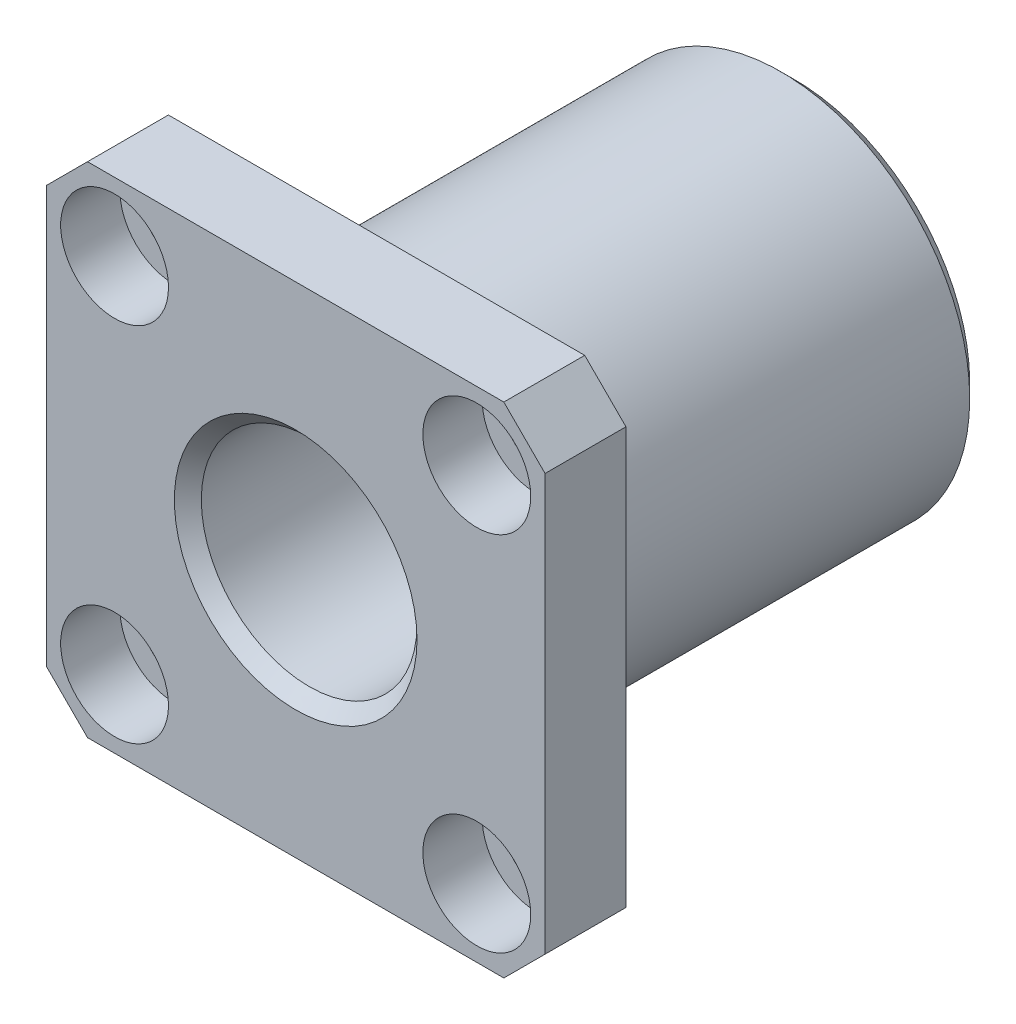
ISO-10303-21;
HEADER;
FILE_DESCRIPTION(('STEP AP214'),'2;1');
FILE_NAME('part.step','',(''),(''),'','','');
FILE_SCHEMA(('AUTOMOTIVE_DESIGN { 1 0 10303 214 1 1 1 1 }'));
ENDSEC;
DATA;
#1=APPLICATION_CONTEXT('core data for automotive mechanical design processes');
#2=APPLICATION_PROTOCOL_DEFINITION('international standard','automotive_design',2000,#1);
#3=PRODUCT_CONTEXT('',#1,'mechanical');
#4=PRODUCT('Part','Part','',(#3));
#5=PRODUCT_RELATED_PRODUCT_CATEGORY('part','',(#4));
#6=PRODUCT_DEFINITION_FORMATION('','',#4);
#7=PRODUCT_DEFINITION_CONTEXT('part definition',#1,'design');
#8=PRODUCT_DEFINITION('design','',#6,#7);
#9=PRODUCT_DEFINITION_SHAPE('','',#8);
#10=(LENGTH_UNIT() NAMED_UNIT(*) SI_UNIT(.MILLI.,.METRE.));
#11=(NAMED_UNIT(*) PLANE_ANGLE_UNIT() SI_UNIT($,.RADIAN.));
#12=(NAMED_UNIT(*) SI_UNIT($,.STERADIAN.) SOLID_ANGLE_UNIT());
#13=UNCERTAINTY_MEASURE_WITH_UNIT(LENGTH_MEASURE(1.E-05),#10,'distance_accuracy_value','');
#14=(GEOMETRIC_REPRESENTATION_CONTEXT(3) GLOBAL_UNCERTAINTY_ASSIGNED_CONTEXT((#13)) GLOBAL_UNIT_ASSIGNED_CONTEXT((#10,
#11,#12)) REPRESENTATION_CONTEXT('',''));
#15=CARTESIAN_POINT('',(0.,0.,0.));
#16=DIRECTION('',(0.,0.,1.));
#17=DIRECTION('',(1.,0.,0.));
#18=AXIS2_PLACEMENT_3D('',#15,#16,#17);
#19=CARTESIAN_POINT('',(0.,0.,37.));
#20=DIRECTION('',(0.,0.,-1.));
#21=DIRECTION('',(-1.,0.,0.));
#22=AXIS2_PLACEMENT_3D('',#19,#20,#21);
#23=CYLINDRICAL_SURFACE('',#22,14.);
#24=CARTESIAN_POINT('',(0.,0.,1.00000000000001));
#25=DIRECTION('',(0.,0.,1.));
#26=DIRECTION('',(1.,0.,0.));
#27=AXIS2_PLACEMENT_3D('',#24,#25,#26);
#28=CIRCLE('',#27,14.);
#29=CARTESIAN_POINT('',(14.,0.,1.00000000000001));
#30=VERTEX_POINT('',#29);
#31=EDGE_CURVE('E141',#30,#30,#28,.T.);
#32=ORIENTED_EDGE('',*,*,#31,.T.);
#33=EDGE_LOOP('',(#32));
#34=FACE_BOUND('',#33,.T.);
#35=CARTESIAN_POINT('',(0.,0.,31.));
#36=DIRECTION('',(0.,0.,-1.));
#37=DIRECTION('',(-1.,0.,0.));
#38=AXIS2_PLACEMENT_3D('',#35,#36,#37);
#39=CIRCLE('',#38,14.);
#40=CARTESIAN_POINT('',(-14.,0.,31.));
#41=VERTEX_POINT('',#40);
#42=EDGE_CURVE('E138',#41,#41,#39,.T.);
#43=ORIENTED_EDGE('',*,*,#42,.T.);
#44=EDGE_LOOP('',(#43));
#45=FACE_BOUND('',#44,.T.);
#46=ADVANCED_FACE('F33',(#34,#45),#23,.T.);
#47=CARTESIAN_POINT('',(0.,0.,0.));
#48=DIRECTION('',(0.,0.,1.));
#49=DIRECTION('',(1.,0.,0.));
#50=AXIS2_PLACEMENT_3D('',#47,#48,#49);
#51=PLANE('',#50);
#52=CARTESIAN_POINT('',(0.,0.,0.));
#53=DIRECTION('',(0.,0.,1.));
#54=DIRECTION('',(1.,0.,0.));
#55=AXIS2_PLACEMENT_3D('',#52,#53,#54);
#56=CIRCLE('',#55,13.);
#57=CARTESIAN_POINT('',(13.,0.,0.));
#58=VERTEX_POINT('',#57);
#59=EDGE_CURVE('E164',#58,#58,#56,.F.);
#60=ORIENTED_EDGE('',*,*,#59,.T.);
#61=EDGE_LOOP('',(#60));
#62=FACE_BOUND('',#61,.T.);
#63=CARTESIAN_POINT('',(0.,0.,0.));
#64=DIRECTION('',(0.,0.,1.));
#65=DIRECTION('',(1.,0.,0.));
#66=AXIS2_PLACEMENT_3D('',#63,#64,#65);
#67=CIRCLE('',#66,8.);
#68=CARTESIAN_POINT('',(8.,0.,0.));
#69=VERTEX_POINT('',#68);
#70=EDGE_CURVE('E442',#69,#69,#67,.T.);
#71=ORIENTED_EDGE('',*,*,#70,.T.);
#72=EDGE_LOOP('',(#71));
#73=FACE_BOUND('',#72,.T.);
#74=ADVANCED_FACE('F181',(#62,#73),#51,.F.);
#75=CARTESIAN_POINT('',(18.5,-18.5,31.));
#76=DIRECTION('',(1.,0.,0.));
#77=DIRECTION('',(0.,0.,-1.));
#78=AXIS2_PLACEMENT_3D('',#75,#76,#77);
#79=PLANE('',#78);
#80=DIRECTION('',(0.,0.,1.));
#81=VECTOR('',#80,1.);
#82=CARTESIAN_POINT('',(18.5,-15.4411254969543,0.));
#83=LINE('',#82,#81);
#84=CARTESIAN_POINT('',(18.5,-15.4411254969543,31.));
#85=VERTEX_POINT('',#84);
#86=CARTESIAN_POINT('',(18.5,-15.4411254969543,37.));
#87=VERTEX_POINT('',#86);
#88=EDGE_CURVE('E474',#85,#87,#83,.T.);
#89=ORIENTED_EDGE('',*,*,#88,.F.);
#90=DIRECTION('',(0.,1.,0.));
#91=VECTOR('',#90,1.);
#92=CARTESIAN_POINT('',(18.5,-18.5,31.));
#93=LINE('',#92,#91);
#94=CARTESIAN_POINT('',(18.5,15.4411254969543,31.));
#95=VERTEX_POINT('',#94);
#96=EDGE_CURVE('E117',#85,#95,#93,.T.);
#97=ORIENTED_EDGE('',*,*,#96,.T.);
#98=DIRECTION('',(0.,0.,1.));
#99=VECTOR('',#98,1.);
#100=CARTESIAN_POINT('',(18.5,15.4411254969543,0.));
#101=LINE('',#100,#99);
#102=CARTESIAN_POINT('',(18.5,15.4411254969543,37.));
#103=VERTEX_POINT('',#102);
#104=EDGE_CURVE('E100',#95,#103,#101,.T.);
#105=ORIENTED_EDGE('',*,*,#104,.T.);
#106=DIRECTION('',(0.,1.,0.));
#107=VECTOR('',#106,1.);
#108=CARTESIAN_POINT('',(18.5,-18.5,37.));
#109=LINE('',#108,#107);
#110=EDGE_CURVE('E115',#87,#103,#109,.T.);
#111=ORIENTED_EDGE('',*,*,#110,.F.);
#112=EDGE_LOOP('',(#89,#97,#105,#111));
#113=FACE_BOUND('',#112,.T.);
#114=ADVANCED_FACE('F114',(#113),#79,.T.);
#115=CARTESIAN_POINT('',(-18.5,-18.5,31.));
#116=DIRECTION('',(0.,-1.,0.));
#117=DIRECTION('',(0.,0.,-1.));
#118=AXIS2_PLACEMENT_3D('',#115,#116,#117);
#119=PLANE('',#118);
#120=DIRECTION('',(0.,0.,1.));
#121=VECTOR('',#120,1.);
#122=CARTESIAN_POINT('',(-15.4411254969543,-18.5,0.));
#123=LINE('',#122,#121);
#124=CARTESIAN_POINT('',(-15.4411254969543,-18.5,31.));
#125=VERTEX_POINT('',#124);
#126=CARTESIAN_POINT('',(-15.4411254969543,-18.5,37.));
#127=VERTEX_POINT('',#126);
#128=EDGE_CURVE('E48',#125,#127,#123,.T.);
#129=ORIENTED_EDGE('',*,*,#128,.F.);
#130=DIRECTION('',(1.,0.,0.));
#131=VECTOR('',#130,1.);
#132=CARTESIAN_POINT('',(-18.5,-18.5,31.));
#133=LINE('',#132,#131);
#134=CARTESIAN_POINT('',(15.4411254969543,-18.5,31.));
#135=VERTEX_POINT('',#134);
#136=EDGE_CURVE('E131',#125,#135,#133,.T.);
#137=ORIENTED_EDGE('',*,*,#136,.T.);
#138=DIRECTION('',(0.,0.,1.));
#139=VECTOR('',#138,1.);
#140=CARTESIAN_POINT('',(15.4411254969543,-18.5,0.));
#141=LINE('',#140,#139);
#142=CARTESIAN_POINT('',(15.4411254969543,-18.5,37.));
#143=VERTEX_POINT('',#142);
#144=EDGE_CURVE('E108',#135,#143,#141,.T.);
#145=ORIENTED_EDGE('',*,*,#144,.T.);
#146=DIRECTION('',(1.,0.,0.));
#147=VECTOR('',#146,1.);
#148=CARTESIAN_POINT('',(-18.5,-18.5,37.));
#149=LINE('',#148,#147);
#150=EDGE_CURVE('E136',#127,#143,#149,.T.);
#151=ORIENTED_EDGE('',*,*,#150,.F.);
#152=EDGE_LOOP('',(#129,#137,#145,#151));
#153=FACE_BOUND('',#152,.T.);
#154=ADVANCED_FACE('F198',(#153),#119,.T.);
#155=CARTESIAN_POINT('',(-18.5,-18.5,31.));
#156=DIRECTION('',(-1.,0.,0.));
#157=DIRECTION('',(0.,0.,1.));
#158=AXIS2_PLACEMENT_3D('',#155,#156,#157);
#159=PLANE('',#158);
#160=DIRECTION('',(0.,0.,1.));
#161=VECTOR('',#160,1.);
#162=CARTESIAN_POINT('',(-18.5,-15.4411254969543,0.));
#163=LINE('',#162,#161);
#164=CARTESIAN_POINT('',(-18.5,-15.4411254969543,31.));
#165=VERTEX_POINT('',#164);
#166=CARTESIAN_POINT('',(-18.5,-15.4411254969543,37.));
#167=VERTEX_POINT('',#166);
#168=EDGE_CURVE('E479',#165,#167,#163,.T.);
#169=ORIENTED_EDGE('',*,*,#168,.T.);
#170=DIRECTION('',(0.,-1.,0.));
#171=VECTOR('',#170,1.);
#172=CARTESIAN_POINT('',(-18.5,-18.5,37.));
#173=LINE('',#172,#171);
#174=CARTESIAN_POINT('',(-18.5,15.4411254969543,37.));
#175=VERTEX_POINT('',#174);
#176=EDGE_CURVE('E126',#175,#167,#173,.T.);
#177=ORIENTED_EDGE('',*,*,#176,.F.);
#178=DIRECTION('',(0.,0.,1.));
#179=VECTOR('',#178,1.);
#180=CARTESIAN_POINT('',(-18.5,15.4411254969543,0.));
#181=LINE('',#180,#179);
#182=CARTESIAN_POINT('',(-18.5,15.4411254969543,31.));
#183=VERTEX_POINT('',#182);
#184=EDGE_CURVE('E56',#183,#175,#181,.T.);
#185=ORIENTED_EDGE('',*,*,#184,.F.);
#186=DIRECTION('',(0.,-1.,0.));
#187=VECTOR('',#186,1.);
#188=CARTESIAN_POINT('',(-18.5,-18.5,31.));
#189=LINE('',#188,#187);
#190=EDGE_CURVE('E496',#183,#165,#189,.T.);
#191=ORIENTED_EDGE('',*,*,#190,.T.);
#192=EDGE_LOOP('',(#169,#177,#185,#191));
#193=FACE_BOUND('',#192,.T.);
#194=ADVANCED_FACE('F202',(#193),#159,.T.);
#195=CARTESIAN_POINT('',(-18.5,18.5,31.));
#196=DIRECTION('',(0.,1.,0.));
#197=DIRECTION('',(0.,0.,1.));
#198=AXIS2_PLACEMENT_3D('',#195,#196,#197);
#199=PLANE('',#198);
#200=DIRECTION('',(0.,0.,1.));
#201=VECTOR('',#200,1.);
#202=CARTESIAN_POINT('',(15.4411254969543,18.5,0.));
#203=LINE('',#202,#201);
#204=CARTESIAN_POINT('',(15.4411254969543,18.5,31.));
#205=VERTEX_POINT('',#204);
#206=CARTESIAN_POINT('',(15.4411254969543,18.5,37.));
#207=VERTEX_POINT('',#206);
#208=EDGE_CURVE('E103',#205,#207,#203,.T.);
#209=ORIENTED_EDGE('',*,*,#208,.F.);
#210=DIRECTION('',(-1.,0.,0.));
#211=VECTOR('',#210,1.);
#212=CARTESIAN_POINT('',(-18.5,18.5,31.));
#213=LINE('',#212,#211);
#214=CARTESIAN_POINT('',(-15.4411254969543,18.5,31.));
#215=VERTEX_POINT('',#214);
#216=EDGE_CURVE('E494',#205,#215,#213,.T.);
#217=ORIENTED_EDGE('',*,*,#216,.T.);
#218=DIRECTION('',(0.,0.,1.));
#219=VECTOR('',#218,1.);
#220=CARTESIAN_POINT('',(-15.4411254969543,18.5,0.));
#221=LINE('',#220,#219);
#222=CARTESIAN_POINT('',(-15.4411254969543,18.5,37.));
#223=VERTEX_POINT('',#222);
#224=EDGE_CURVE('E484',#215,#223,#221,.T.);
#225=ORIENTED_EDGE('',*,*,#224,.T.);
#226=DIRECTION('',(-1.,0.,0.));
#227=VECTOR('',#226,1.);
#228=CARTESIAN_POINT('',(-18.5,18.5,37.));
#229=LINE('',#228,#227);
#230=EDGE_CURVE('E123',#207,#223,#229,.T.);
#231=ORIENTED_EDGE('',*,*,#230,.F.);
#232=EDGE_LOOP('',(#209,#217,#225,#231));
#233=FACE_BOUND('',#232,.T.);
#234=ADVANCED_FACE('F199',(#233),#199,.T.);
#235=CARTESIAN_POINT('',(0.,0.,31.));
#236=DIRECTION('',(0.,0.,-1.));
#237=DIRECTION('',(-1.,0.,0.));
#238=AXIS2_PLACEMENT_3D('',#235,#236,#237);
#239=PLANE('',#238);
#240=CARTESIAN_POINT('',(-13.4350288425444,13.4350288425444,31.));
#241=DIRECTION('',(0.,0.,-1.));
#242=DIRECTION('',(-1.,0.,0.));
#243=AXIS2_PLACEMENT_3D('',#240,#241,#242);
#244=CIRCLE('',#243,2.25);
#245=CARTESIAN_POINT('',(-15.6850288425444,13.4350288425444,31.));
#246=VERTEX_POINT('',#245);
#247=EDGE_CURVE('E157',#246,#246,#244,.T.);
#248=ORIENTED_EDGE('',*,*,#247,.F.);
#249=EDGE_LOOP('',(#248));
#250=FACE_BOUND('',#249,.T.);
#251=CARTESIAN_POINT('',(13.4350288425444,13.4350288425444,31.));
#252=DIRECTION('',(0.,0.,-1.));
#253=DIRECTION('',(-1.,0.,0.));
#254=AXIS2_PLACEMENT_3D('',#251,#252,#253);
#255=CIRCLE('',#254,2.25);
#256=CARTESIAN_POINT('',(11.1850288425444,13.4350288425444,31.));
#257=VERTEX_POINT('',#256);
#258=EDGE_CURVE('E152',#257,#257,#255,.T.);
#259=ORIENTED_EDGE('',*,*,#258,.F.);
#260=EDGE_LOOP('',(#259));
#261=FACE_BOUND('',#260,.T.);
#262=CARTESIAN_POINT('',(13.4350288425444,-13.4350288425444,31.));
#263=DIRECTION('',(0.,0.,-1.));
#264=DIRECTION('',(-1.,0.,0.));
#265=AXIS2_PLACEMENT_3D('',#262,#263,#264);
#266=CIRCLE('',#265,2.25);
#267=CARTESIAN_POINT('',(11.1850288425444,-13.4350288425444,31.));
#268=VERTEX_POINT('',#267);
#269=EDGE_CURVE('E147',#268,#268,#266,.T.);
#270=ORIENTED_EDGE('',*,*,#269,.F.);
#271=EDGE_LOOP('',(#270));
#272=FACE_BOUND('',#271,.T.);
#273=CARTESIAN_POINT('',(-13.4350288425444,-13.4350288425444,31.));
#274=DIRECTION('',(0.,0.,-1.));
#275=DIRECTION('',(-1.,0.,0.));
#276=AXIS2_PLACEMENT_3D('',#273,#274,#275);
#277=CIRCLE('',#276,2.25);
#278=CARTESIAN_POINT('',(-15.6850288425444,-13.4350288425444,31.));
#279=VERTEX_POINT('',#278);
#280=EDGE_CURVE('E142',#279,#279,#277,.T.);
#281=ORIENTED_EDGE('',*,*,#280,.F.);
#282=EDGE_LOOP('',(#281));
#283=FACE_BOUND('',#282,.T.);
#284=DIRECTION('',(0.707106781186548,-0.707106781186548,0.));
#285=VECTOR('',#284,1.);
#286=CARTESIAN_POINT('',(-16.9705627484771,-16.9705627484771,31.));
#287=LINE('',#286,#285);
#288=EDGE_CURVE('E124',#165,#125,#287,.T.);
#289=ORIENTED_EDGE('',*,*,#288,.F.);
#290=ORIENTED_EDGE('',*,*,#190,.F.);
#291=DIRECTION('',(-0.707106781186548,-0.707106781186548,0.));
#292=VECTOR('',#291,1.);
#293=CARTESIAN_POINT('',(-16.9705627484771,16.9705627484771,31.));
#294=LINE('',#293,#292);
#295=EDGE_CURVE('E487',#215,#183,#294,.T.);
#296=ORIENTED_EDGE('',*,*,#295,.F.);
#297=ORIENTED_EDGE('',*,*,#216,.F.);
#298=DIRECTION('',(-0.707106781186548,0.707106781186548,0.));
#299=VECTOR('',#298,1.);
#300=CARTESIAN_POINT('',(16.9705627484771,16.9705627484771,31.));
#301=LINE('',#300,#299);
#302=EDGE_CURVE('E490',#95,#205,#301,.T.);
#303=ORIENTED_EDGE('',*,*,#302,.F.);
#304=ORIENTED_EDGE('',*,*,#96,.F.);
#305=DIRECTION('',(0.707106781186548,0.707106781186548,0.));
#306=VECTOR('',#305,1.);
#307=CARTESIAN_POINT('',(16.9705627484771,-16.9705627484771,31.));
#308=LINE('',#307,#306);
#309=EDGE_CURVE('E128',#135,#85,#308,.T.);
#310=ORIENTED_EDGE('',*,*,#309,.F.);
#311=ORIENTED_EDGE('',*,*,#136,.F.);
#312=EDGE_LOOP('',(#289,#290,#296,#297,#303,#304,#310,#311));
#313=FACE_BOUND('',#312,.T.);
#314=ORIENTED_EDGE('',*,*,#42,.F.);
#315=EDGE_LOOP('',(#314));
#316=FACE_BOUND('',#315,.T.);
#317=ADVANCED_FACE('F194',(#250,#261,#272,#283,#313,#316),#239,.T.);
#318=CARTESIAN_POINT('',(0.,0.,37.));
#319=DIRECTION('',(0.,0.,1.));
#320=DIRECTION('',(1.,0.,0.));
#321=AXIS2_PLACEMENT_3D('',#318,#319,#320);
#322=PLANE('',#321);
#323=CARTESIAN_POINT('',(0.,0.,37.));
#324=DIRECTION('',(0.,0.,1.));
#325=DIRECTION('',(1.,0.,0.));
#326=AXIS2_PLACEMENT_3D('',#323,#324,#325);
#327=CIRCLE('',#326,9.00000000000001);
#328=CARTESIAN_POINT('',(9.00000000000001,0.,37.));
#329=VERTEX_POINT('',#328);
#330=EDGE_CURVE('E11',#329,#329,#327,.F.);
#331=ORIENTED_EDGE('',*,*,#330,.T.);
#332=EDGE_LOOP('',(#331));
#333=FACE_BOUND('',#332,.T.);
#334=CARTESIAN_POINT('',(-13.4350288425444,13.4350288425444,37.));
#335=DIRECTION('',(0.,0.,1.));
#336=DIRECTION('',(1.,0.,0.));
#337=AXIS2_PLACEMENT_3D('',#334,#335,#336);
#338=CIRCLE('',#337,4.);
#339=CARTESIAN_POINT('',(-9.4350288425444,13.4350288425444,37.));
#340=VERTEX_POINT('',#339);
#341=EDGE_CURVE('E440',#340,#340,#338,.T.);
#342=ORIENTED_EDGE('',*,*,#341,.F.);
#343=EDGE_LOOP('',(#342));
#344=FACE_BOUND('',#343,.T.);
#345=CARTESIAN_POINT('',(13.4350288425444,13.4350288425444,37.));
#346=DIRECTION('',(0.,0.,1.));
#347=DIRECTION('',(1.,0.,0.));
#348=AXIS2_PLACEMENT_3D('',#345,#346,#347);
#349=CIRCLE('',#348,4.);
#350=CARTESIAN_POINT('',(17.4350288425444,13.4350288425444,37.));
#351=VERTEX_POINT('',#350);
#352=EDGE_CURVE('E160',#351,#351,#349,.T.);
#353=ORIENTED_EDGE('',*,*,#352,.F.);
#354=EDGE_LOOP('',(#353));
#355=FACE_BOUND('',#354,.T.);
#356=CARTESIAN_POINT('',(13.4350288425444,-13.4350288425444,37.));
#357=DIRECTION('',(0.,0.,1.));
#358=DIRECTION('',(1.,0.,0.));
#359=AXIS2_PLACEMENT_3D('',#356,#357,#358);
#360=CIRCLE('',#359,4.);
#361=CARTESIAN_POINT('',(17.4350288425444,-13.4350288425444,37.));
#362=VERTEX_POINT('',#361);
#363=EDGE_CURVE('E155',#362,#362,#360,.T.);
#364=ORIENTED_EDGE('',*,*,#363,.F.);
#365=EDGE_LOOP('',(#364));
#366=FACE_BOUND('',#365,.T.);
#367=CARTESIAN_POINT('',(-13.4350288425444,-13.4350288425444,37.));
#368=DIRECTION('',(0.,0.,1.));
#369=DIRECTION('',(1.,0.,0.));
#370=AXIS2_PLACEMENT_3D('',#367,#368,#369);
#371=CIRCLE('',#370,4.);
#372=CARTESIAN_POINT('',(-9.4350288425444,-13.4350288425444,37.));
#373=VERTEX_POINT('',#372);
#374=EDGE_CURVE('E150',#373,#373,#371,.T.);
#375=ORIENTED_EDGE('',*,*,#374,.F.);
#376=EDGE_LOOP('',(#375));
#377=FACE_BOUND('',#376,.T.);
#378=DIRECTION('',(-0.707106781186547,0.707106781186547,0.));
#379=VECTOR('',#378,1.);
#380=CARTESIAN_POINT('',(-18.5,-15.4411254969543,37.));
#381=LINE('',#380,#379);
#382=EDGE_CURVE('E145',#127,#167,#381,.T.);
#383=ORIENTED_EDGE('',*,*,#382,.F.);
#384=ORIENTED_EDGE('',*,*,#150,.T.);
#385=DIRECTION('',(-0.707106781186547,-0.707106781186547,0.));
#386=VECTOR('',#385,1.);
#387=CARTESIAN_POINT('',(18.5,-15.4411254969543,37.));
#388=LINE('',#387,#386);
#389=EDGE_CURVE('E122',#87,#143,#388,.T.);
#390=ORIENTED_EDGE('',*,*,#389,.F.);
#391=ORIENTED_EDGE('',*,*,#110,.T.);
#392=DIRECTION('',(0.707106781186547,-0.707106781186547,0.));
#393=VECTOR('',#392,1.);
#394=CARTESIAN_POINT('',(18.5,15.4411254969543,37.));
#395=LINE('',#394,#393);
#396=EDGE_CURVE('E97',#207,#103,#395,.T.);
#397=ORIENTED_EDGE('',*,*,#396,.F.);
#398=ORIENTED_EDGE('',*,*,#230,.T.);
#399=DIRECTION('',(0.707106781186547,0.707106781186547,0.));
#400=VECTOR('',#399,1.);
#401=CARTESIAN_POINT('',(-18.5,15.4411254969543,37.));
#402=LINE('',#401,#400);
#403=EDGE_CURVE('E471',#175,#223,#402,.T.);
#404=ORIENTED_EDGE('',*,*,#403,.F.);
#405=ORIENTED_EDGE('',*,*,#176,.T.);
#406=EDGE_LOOP('',(#383,#384,#390,#391,#397,#398,#404,#405));
#407=FACE_BOUND('',#406,.T.);
#408=ADVANCED_FACE('F120',(#333,#344,#355,#366,#377,#407),#322,.T.);
#409=CARTESIAN_POINT('',(-18.5,15.4411254969543,0.));
#410=DIRECTION('',(0.707106781186547,-0.707106781186547,0.));
#411=DIRECTION('',(0.707106781186548,0.707106781186548,0.));
#412=AXIS2_PLACEMENT_3D('',#409,#410,#411);
#413=PLANE('',#412);
#414=ORIENTED_EDGE('',*,*,#295,.T.);
#415=ORIENTED_EDGE('',*,*,#184,.T.);
#416=ORIENTED_EDGE('',*,*,#403,.T.);
#417=ORIENTED_EDGE('',*,*,#224,.F.);
#418=EDGE_LOOP('',(#414,#415,#416,#417));
#419=FACE_BOUND('',#418,.T.);
#420=ADVANCED_FACE('F193',(#419),#413,.F.);
#421=CARTESIAN_POINT('',(18.5,15.4411254969543,0.));
#422=DIRECTION('',(-0.707106781186547,-0.707106781186547,0.));
#423=DIRECTION('',(0.707106781186548,-0.707106781186548,0.));
#424=AXIS2_PLACEMENT_3D('',#421,#422,#423);
#425=PLANE('',#424);
#426=ORIENTED_EDGE('',*,*,#302,.T.);
#427=ORIENTED_EDGE('',*,*,#208,.T.);
#428=ORIENTED_EDGE('',*,*,#396,.T.);
#429=ORIENTED_EDGE('',*,*,#104,.F.);
#430=EDGE_LOOP('',(#426,#427,#428,#429));
#431=FACE_BOUND('',#430,.T.);
#432=ADVANCED_FACE('F99',(#431),#425,.F.);
#433=CARTESIAN_POINT('',(18.5,-15.4411254969543,0.));
#434=DIRECTION('',(-0.707106781186547,0.707106781186547,0.));
#435=DIRECTION('',(-0.707106781186548,-0.707106781186548,0.));
#436=AXIS2_PLACEMENT_3D('',#433,#434,#435);
#437=PLANE('',#436);
#438=ORIENTED_EDGE('',*,*,#309,.T.);
#439=ORIENTED_EDGE('',*,*,#88,.T.);
#440=ORIENTED_EDGE('',*,*,#389,.T.);
#441=ORIENTED_EDGE('',*,*,#144,.F.);
#442=EDGE_LOOP('',(#438,#439,#440,#441));
#443=FACE_BOUND('',#442,.T.);
#444=ADVANCED_FACE('F219',(#443),#437,.F.);
#445=CARTESIAN_POINT('',(-18.5,-15.4411254969543,0.));
#446=DIRECTION('',(0.707106781186547,0.707106781186547,0.));
#447=DIRECTION('',(-0.707106781186548,0.707106781186548,0.));
#448=AXIS2_PLACEMENT_3D('',#445,#446,#447);
#449=PLANE('',#448);
#450=ORIENTED_EDGE('',*,*,#288,.T.);
#451=ORIENTED_EDGE('',*,*,#128,.T.);
#452=ORIENTED_EDGE('',*,*,#382,.T.);
#453=ORIENTED_EDGE('',*,*,#168,.F.);
#454=EDGE_LOOP('',(#450,#451,#452,#453));
#455=FACE_BOUND('',#454,.T.);
#456=ADVANCED_FACE('F215',(#455),#449,.F.);
#457=CARTESIAN_POINT('',(-13.4350288425444,-13.4350288425444,37.));
#458=DIRECTION('',(0.,0.,1.));
#459=DIRECTION('',(1.,0.,0.));
#460=AXIS2_PLACEMENT_3D('',#457,#458,#459);
#461=CYLINDRICAL_SURFACE('',#460,2.25);
#462=ORIENTED_EDGE('',*,*,#280,.T.);
#463=EDGE_LOOP('',(#462));
#464=FACE_BOUND('',#463,.T.);
#465=CARTESIAN_POINT('',(-13.4350288425444,-13.4350288425444,32.6));
#466=DIRECTION('',(0.,0.,1.));
#467=DIRECTION('',(1.,0.,0.));
#468=AXIS2_PLACEMENT_3D('',#465,#466,#467);
#469=CIRCLE('',#468,2.25);
#470=CARTESIAN_POINT('',(-11.1850288425444,-13.4350288425444,32.6));
#471=VERTEX_POINT('',#470);
#472=EDGE_CURVE('E146',#471,#471,#469,.T.);
#473=ORIENTED_EDGE('',*,*,#472,.T.);
#474=EDGE_LOOP('',(#473));
#475=FACE_BOUND('',#474,.T.);
#476=ADVANCED_FACE('F218',(#464,#475),#461,.F.);
#477=CARTESIAN_POINT('',(-11.1850288425444,-13.4350288425444,32.6));
#478=DIRECTION('',(0.,0.,-1.));
#479=DIRECTION('',(-1.,0.,0.));
#480=AXIS2_PLACEMENT_3D('',#477,#478,#479);
#481=PLANE('',#480);
#482=ORIENTED_EDGE('',*,*,#472,.F.);
#483=EDGE_LOOP('',(#482));
#484=FACE_BOUND('',#483,.T.);
#485=CARTESIAN_POINT('',(-13.4350288425444,-13.4350288425444,32.6));
#486=DIRECTION('',(0.,0.,1.));
#487=DIRECTION('',(1.,0.,0.));
#488=AXIS2_PLACEMENT_3D('',#485,#486,#487);
#489=CIRCLE('',#488,4.);
#490=CARTESIAN_POINT('',(-9.4350288425444,-13.4350288425444,32.6));
#491=VERTEX_POINT('',#490);
#492=EDGE_CURVE('E466',#491,#491,#489,.T.);
#493=ORIENTED_EDGE('',*,*,#492,.T.);
#494=EDGE_LOOP('',(#493));
#495=FACE_BOUND('',#494,.T.);
#496=ADVANCED_FACE('F227',(#484,#495),#481,.F.);
#497=CARTESIAN_POINT('',(-13.4350288425444,-13.4350288425444,37.));
#498=DIRECTION('',(0.,0.,1.));
#499=DIRECTION('',(1.,0.,0.));
#500=AXIS2_PLACEMENT_3D('',#497,#498,#499);
#501=CYLINDRICAL_SURFACE('',#500,4.);
#502=ORIENTED_EDGE('',*,*,#492,.F.);
#503=EDGE_LOOP('',(#502));
#504=FACE_BOUND('',#503,.T.);
#505=ORIENTED_EDGE('',*,*,#374,.T.);
#506=EDGE_LOOP('',(#505));
#507=FACE_BOUND('',#506,.T.);
#508=ADVANCED_FACE('F231',(#504,#507),#501,.F.);
#509=CARTESIAN_POINT('',(13.4350288425444,-13.4350288425444,37.));
#510=DIRECTION('',(0.,0.,1.));
#511=DIRECTION('',(1.,0.,0.));
#512=AXIS2_PLACEMENT_3D('',#509,#510,#511);
#513=CYLINDRICAL_SURFACE('',#512,2.25);
#514=ORIENTED_EDGE('',*,*,#269,.T.);
#515=EDGE_LOOP('',(#514));
#516=FACE_BOUND('',#515,.T.);
#517=CARTESIAN_POINT('',(13.4350288425444,-13.4350288425444,32.6));
#518=DIRECTION('',(0.,0.,1.));
#519=DIRECTION('',(1.,0.,0.));
#520=AXIS2_PLACEMENT_3D('',#517,#518,#519);
#521=CIRCLE('',#520,2.25);
#522=CARTESIAN_POINT('',(15.6850288425444,-13.4350288425444,32.6));
#523=VERTEX_POINT('',#522);
#524=EDGE_CURVE('E151',#523,#523,#521,.T.);
#525=ORIENTED_EDGE('',*,*,#524,.T.);
#526=EDGE_LOOP('',(#525));
#527=FACE_BOUND('',#526,.T.);
#528=ADVANCED_FACE('F235',(#516,#527),#513,.F.);
#529=CARTESIAN_POINT('',(15.6850288425444,-13.4350288425444,32.6));
#530=DIRECTION('',(0.,0.,-1.));
#531=DIRECTION('',(-1.,0.,0.));
#532=AXIS2_PLACEMENT_3D('',#529,#530,#531);
#533=PLANE('',#532);
#534=ORIENTED_EDGE('',*,*,#524,.F.);
#535=EDGE_LOOP('',(#534));
#536=FACE_BOUND('',#535,.T.);
#537=CARTESIAN_POINT('',(13.4350288425444,-13.4350288425444,32.6));
#538=DIRECTION('',(0.,0.,1.));
#539=DIRECTION('',(1.,0.,0.));
#540=AXIS2_PLACEMENT_3D('',#537,#538,#539);
#541=CIRCLE('',#540,4.);
#542=CARTESIAN_POINT('',(17.4350288425444,-13.4350288425444,32.6));
#543=VERTEX_POINT('',#542);
#544=EDGE_CURVE('E459',#543,#543,#541,.T.);
#545=ORIENTED_EDGE('',*,*,#544,.T.);
#546=EDGE_LOOP('',(#545));
#547=FACE_BOUND('',#546,.T.);
#548=ADVANCED_FACE('F239',(#536,#547),#533,.F.);
#549=CARTESIAN_POINT('',(13.4350288425444,-13.4350288425444,37.));
#550=DIRECTION('',(0.,0.,1.));
#551=DIRECTION('',(1.,0.,0.));
#552=AXIS2_PLACEMENT_3D('',#549,#550,#551);
#553=CYLINDRICAL_SURFACE('',#552,4.);
#554=ORIENTED_EDGE('',*,*,#544,.F.);
#555=EDGE_LOOP('',(#554));
#556=FACE_BOUND('',#555,.T.);
#557=ORIENTED_EDGE('',*,*,#363,.T.);
#558=EDGE_LOOP('',(#557));
#559=FACE_BOUND('',#558,.T.);
#560=ADVANCED_FACE('F243',(#556,#559),#553,.F.);
#561=CARTESIAN_POINT('',(13.4350288425444,13.4350288425444,37.));
#562=DIRECTION('',(0.,0.,1.));
#563=DIRECTION('',(1.,0.,0.));
#564=AXIS2_PLACEMENT_3D('',#561,#562,#563);
#565=CYLINDRICAL_SURFACE('',#564,2.25);
#566=ORIENTED_EDGE('',*,*,#258,.T.);
#567=EDGE_LOOP('',(#566));
#568=FACE_BOUND('',#567,.T.);
#569=CARTESIAN_POINT('',(13.4350288425444,13.4350288425444,32.6));
#570=DIRECTION('',(0.,0.,1.));
#571=DIRECTION('',(1.,0.,0.));
#572=AXIS2_PLACEMENT_3D('',#569,#570,#571);
#573=CIRCLE('',#572,2.25);
#574=CARTESIAN_POINT('',(15.6850288425444,13.4350288425444,32.6));
#575=VERTEX_POINT('',#574);
#576=EDGE_CURVE('E156',#575,#575,#573,.T.);
#577=ORIENTED_EDGE('',*,*,#576,.T.);
#578=EDGE_LOOP('',(#577));
#579=FACE_BOUND('',#578,.T.);
#580=ADVANCED_FACE('F247',(#568,#579),#565,.F.);
#581=CARTESIAN_POINT('',(15.6850288425444,13.4350288425444,32.6));
#582=DIRECTION('',(0.,0.,-1.));
#583=DIRECTION('',(-1.,0.,0.));
#584=AXIS2_PLACEMENT_3D('',#581,#582,#583);
#585=PLANE('',#584);
#586=ORIENTED_EDGE('',*,*,#576,.F.);
#587=EDGE_LOOP('',(#586));
#588=FACE_BOUND('',#587,.T.);
#589=CARTESIAN_POINT('',(13.4350288425444,13.4350288425444,32.6));
#590=DIRECTION('',(0.,0.,1.));
#591=DIRECTION('',(1.,0.,0.));
#592=AXIS2_PLACEMENT_3D('',#589,#590,#591);
#593=CIRCLE('',#592,4.);
#594=CARTESIAN_POINT('',(17.4350288425444,13.4350288425444,32.6));
#595=VERTEX_POINT('',#594);
#596=EDGE_CURVE('E452',#595,#595,#593,.T.);
#597=ORIENTED_EDGE('',*,*,#596,.T.);
#598=EDGE_LOOP('',(#597));
#599=FACE_BOUND('',#598,.T.);
#600=ADVANCED_FACE('F251',(#588,#599),#585,.F.);
#601=CARTESIAN_POINT('',(13.4350288425444,13.4350288425444,37.));
#602=DIRECTION('',(0.,0.,1.));
#603=DIRECTION('',(1.,0.,0.));
#604=AXIS2_PLACEMENT_3D('',#601,#602,#603);
#605=CYLINDRICAL_SURFACE('',#604,4.);
#606=ORIENTED_EDGE('',*,*,#596,.F.);
#607=EDGE_LOOP('',(#606));
#608=FACE_BOUND('',#607,.T.);
#609=ORIENTED_EDGE('',*,*,#352,.T.);
#610=EDGE_LOOP('',(#609));
#611=FACE_BOUND('',#610,.T.);
#612=ADVANCED_FACE('F255',(#608,#611),#605,.F.);
#613=CARTESIAN_POINT('',(-13.4350288425444,13.4350288425444,37.));
#614=DIRECTION('',(0.,0.,1.));
#615=DIRECTION('',(1.,0.,0.));
#616=AXIS2_PLACEMENT_3D('',#613,#614,#615);
#617=CYLINDRICAL_SURFACE('',#616,2.25);
#618=ORIENTED_EDGE('',*,*,#247,.T.);
#619=EDGE_LOOP('',(#618));
#620=FACE_BOUND('',#619,.T.);
#621=CARTESIAN_POINT('',(-13.4350288425444,13.4350288425444,32.6));
#622=DIRECTION('',(0.,0.,1.));
#623=DIRECTION('',(1.,0.,0.));
#624=AXIS2_PLACEMENT_3D('',#621,#622,#623);
#625=CIRCLE('',#624,2.25);
#626=CARTESIAN_POINT('',(-11.1850288425444,13.4350288425444,32.6));
#627=VERTEX_POINT('',#626);
#628=EDGE_CURVE('E161',#627,#627,#625,.T.);
#629=ORIENTED_EDGE('',*,*,#628,.T.);
#630=EDGE_LOOP('',(#629));
#631=FACE_BOUND('',#630,.T.);
#632=ADVANCED_FACE('F259',(#620,#631),#617,.F.);
#633=CARTESIAN_POINT('',(-11.1850288425444,13.4350288425444,32.6));
#634=DIRECTION('',(0.,0.,-1.));
#635=DIRECTION('',(-1.,0.,0.));
#636=AXIS2_PLACEMENT_3D('',#633,#634,#635);
#637=PLANE('',#636);
#638=ORIENTED_EDGE('',*,*,#628,.F.);
#639=EDGE_LOOP('',(#638));
#640=FACE_BOUND('',#639,.T.);
#641=CARTESIAN_POINT('',(-13.4350288425444,13.4350288425444,32.6));
#642=DIRECTION('',(0.,0.,1.));
#643=DIRECTION('',(1.,0.,0.));
#644=AXIS2_PLACEMENT_3D('',#641,#642,#643);
#645=CIRCLE('',#644,4.);
#646=CARTESIAN_POINT('',(-9.4350288425444,13.4350288425444,32.6));
#647=VERTEX_POINT('',#646);
#648=EDGE_CURVE('E437',#647,#647,#645,.T.);
#649=ORIENTED_EDGE('',*,*,#648,.T.);
#650=EDGE_LOOP('',(#649));
#651=FACE_BOUND('',#650,.T.);
#652=ADVANCED_FACE('F263',(#640,#651),#637,.F.);
#653=CARTESIAN_POINT('',(-13.4350288425444,13.4350288425444,37.));
#654=DIRECTION('',(0.,0.,1.));
#655=DIRECTION('',(1.,0.,0.));
#656=AXIS2_PLACEMENT_3D('',#653,#654,#655);
#657=CYLINDRICAL_SURFACE('',#656,4.);
#658=ORIENTED_EDGE('',*,*,#648,.F.);
#659=EDGE_LOOP('',(#658));
#660=FACE_BOUND('',#659,.T.);
#661=ORIENTED_EDGE('',*,*,#341,.T.);
#662=EDGE_LOOP('',(#661));
#663=FACE_BOUND('',#662,.T.);
#664=ADVANCED_FACE('F267',(#660,#663),#657,.F.);
#665=CARTESIAN_POINT('',(0.,0.,0.));
#666=DIRECTION('',(0.,0.,1.));
#667=DIRECTION('',(1.,0.,0.));
#668=AXIS2_PLACEMENT_3D('',#665,#666,#667);
#669=CYLINDRICAL_SURFACE('',#668,8.);
#670=CARTESIAN_POINT('',(0.,0.,36.));
#671=DIRECTION('',(0.,0.,1.));
#672=DIRECTION('',(1.,0.,0.));
#673=AXIS2_PLACEMENT_3D('',#670,#671,#672);
#674=CIRCLE('',#673,8.);
#675=CARTESIAN_POINT('',(8.,0.,36.));
#676=VERTEX_POINT('',#675);
#677=EDGE_CURVE('E41',#676,#676,#674,.T.);
#678=ORIENTED_EDGE('',*,*,#677,.T.);
#679=EDGE_LOOP('',(#678));
#680=FACE_BOUND('',#679,.T.);
#681=ORIENTED_EDGE('',*,*,#70,.F.);
#682=EDGE_LOOP('',(#681));
#683=FACE_BOUND('',#682,.T.);
#684=ADVANCED_FACE('F169',(#680,#683),#669,.F.);
#685=CARTESIAN_POINT('',(0.,0.,1.00000000000001));
#686=DIRECTION('',(0.,0.,1.));
#687=DIRECTION('',(1.,0.,0.));
#688=AXIS2_PLACEMENT_3D('',#685,#686,#687);
#689=CONICAL_SURFACE('',#688,14.,0.78539816339745);
#690=ORIENTED_EDGE('',*,*,#59,.F.);
#691=EDGE_LOOP('',(#690));
#692=FACE_BOUND('',#691,.T.);
#693=ORIENTED_EDGE('',*,*,#31,.F.);
#694=EDGE_LOOP('',(#693));
#695=FACE_BOUND('',#694,.T.);
#696=ADVANCED_FACE('F173',(#692,#695),#689,.T.);
#697=CARTESIAN_POINT('',(0.,0.,36.));
#698=DIRECTION('',(0.,0.,1.));
#699=DIRECTION('',(1.,0.,0.));
#700=AXIS2_PLACEMENT_3D('',#697,#698,#699);
#701=CONICAL_SURFACE('',#700,8.,0.785398163397452);
#702=ORIENTED_EDGE('',*,*,#330,.F.);
#703=EDGE_LOOP('',(#702));
#704=FACE_BOUND('',#703,.T.);
#705=ORIENTED_EDGE('',*,*,#677,.F.);
#706=EDGE_LOOP('',(#705));
#707=FACE_BOUND('',#706,.T.);
#708=ADVANCED_FACE('F35',(#704,#707),#701,.F.);
#709=CLOSED_SHELL('',(#46,#74,#114,#154,#194,#234,#317,#408,#420,#432,#444,#456,#476,#496,#508,
#528,#548,#560,#580,#600,#612,#632,#652,#664,#684,#696,#708));
#710=MANIFOLD_SOLID_BREP('B2',#709);
#711=ADVANCED_BREP_SHAPE_REPRESENTATION('',(#18,#710),#14);
#712=SHAPE_DEFINITION_REPRESENTATION(#9,#711);
ENDSEC;
END-ISO-10303-21;
